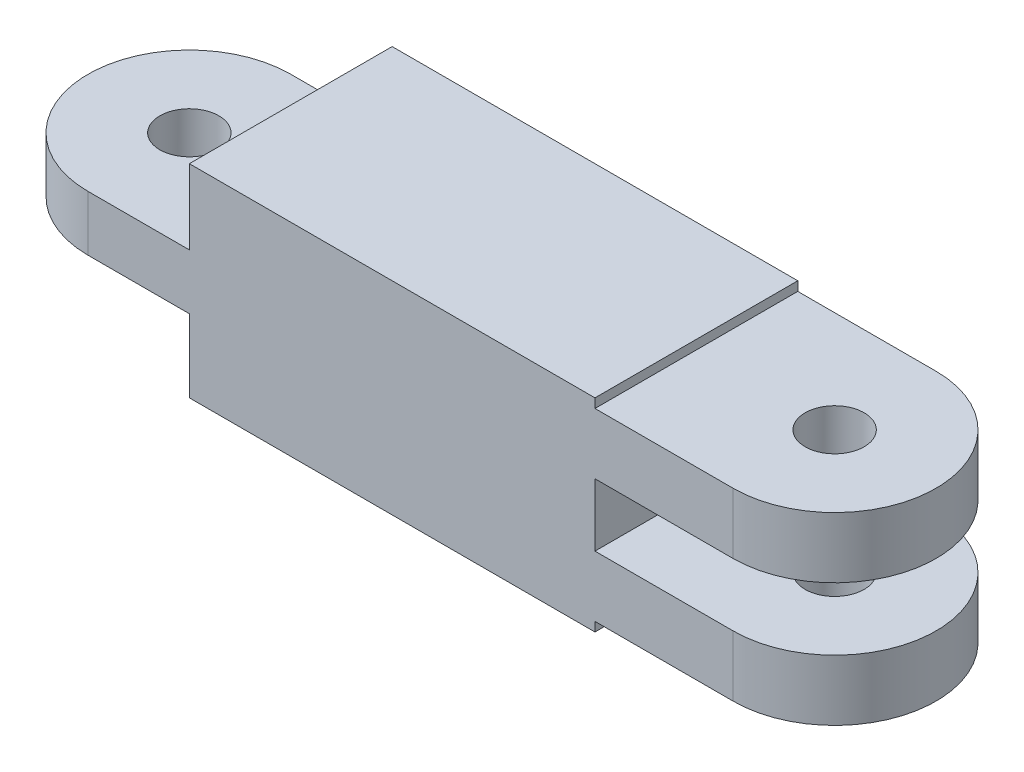
ISO-10303-21;
HEADER;
FILE_DESCRIPTION(('STEP AP214'),'2;1');
FILE_NAME('part.step','',(''),(''),'','','');
FILE_SCHEMA(('AUTOMOTIVE_DESIGN { 1 0 10303 214 1 1 1 1 }'));
ENDSEC;
DATA;
#1=APPLICATION_CONTEXT('core data for automotive mechanical design processes');
#2=APPLICATION_PROTOCOL_DEFINITION('international standard','automotive_design',2000,#1);
#3=PRODUCT_CONTEXT('',#1,'mechanical');
#4=PRODUCT('Part','Part','',(#3));
#5=PRODUCT_RELATED_PRODUCT_CATEGORY('part','',(#4));
#6=PRODUCT_DEFINITION_FORMATION('','',#4);
#7=PRODUCT_DEFINITION_CONTEXT('part definition',#1,'design');
#8=PRODUCT_DEFINITION('design','',#6,#7);
#9=PRODUCT_DEFINITION_SHAPE('','',#8);
#10=(LENGTH_UNIT() NAMED_UNIT(*) SI_UNIT(.MILLI.,.METRE.));
#11=(NAMED_UNIT(*) PLANE_ANGLE_UNIT() SI_UNIT($,.RADIAN.));
#12=(NAMED_UNIT(*) SI_UNIT($,.STERADIAN.) SOLID_ANGLE_UNIT());
#13=UNCERTAINTY_MEASURE_WITH_UNIT(LENGTH_MEASURE(1.E-05),#10,'distance_accuracy_value','');
#14=(GEOMETRIC_REPRESENTATION_CONTEXT(3) GLOBAL_UNCERTAINTY_ASSIGNED_CONTEXT((#13)) GLOBAL_UNIT_ASSIGNED_CONTEXT((#10,
#11,#12)) REPRESENTATION_CONTEXT('',''));
#15=CARTESIAN_POINT('',(0.,0.,0.));
#16=DIRECTION('',(0.,0.,1.));
#17=DIRECTION('',(1.,0.,0.));
#18=AXIS2_PLACEMENT_3D('',#15,#16,#17);
#19=CARTESIAN_POINT('',(17.5030002593994,-42.1589996337891,5.5));
#20=DIRECTION('',(0.,1.,0.));
#21=DIRECTION('',(0.,0.,1.));
#22=AXIS2_PLACEMENT_3D('',#19,#20,#21);
#23=CYLINDRICAL_SURFACE('',#22,5.5);
#24=DIRECTION('',(0.,-1.,0.));
#25=VECTOR('',#24,1.);
#26=CARTESIAN_POINT('',(17.5030002593994,-42.1589996337891,0.));
#27=LINE('',#26,#25);
#28=CARTESIAN_POINT('',(17.5030002593994,-42.1589996337891,0.));
#29=VERTEX_POINT('',#28);
#30=CARTESIAN_POINT('',(17.5030002593994,-45.458999633789,0.));
#31=VERTEX_POINT('',#30);
#32=EDGE_CURVE('E302',#29,#31,#27,.T.);
#33=ORIENTED_EDGE('',*,*,#32,.F.);
#34=CARTESIAN_POINT('',(17.5030002593994,-42.1589996337891,5.5));
#35=DIRECTION('',(0.,1.,0.));
#36=DIRECTION('',(0.,0.,1.));
#37=AXIS2_PLACEMENT_3D('',#34,#35,#36);
#38=CIRCLE('',#37,5.5);
#39=CARTESIAN_POINT('',(17.5030002593994,-42.1589996337891,11.));
#40=VERTEX_POINT('',#39);
#41=EDGE_CURVE('E51',#40,#29,#38,.T.);
#42=ORIENTED_EDGE('',*,*,#41,.F.);
#43=DIRECTION('',(0.,1.,0.));
#44=VECTOR('',#43,1.);
#45=CARTESIAN_POINT('',(17.5030002593994,0.,11.));
#46=LINE('',#45,#44);
#47=CARTESIAN_POINT('',(17.5030002593994,-45.458999633789,11.));
#48=VERTEX_POINT('',#47);
#49=EDGE_CURVE('E305',#48,#40,#46,.T.);
#50=ORIENTED_EDGE('',*,*,#49,.F.);
#51=CARTESIAN_POINT('',(17.5030002593994,-45.458999633789,5.5));
#52=DIRECTION('',(0.,-1.,0.));
#53=DIRECTION('',(0.,0.,-1.));
#54=AXIS2_PLACEMENT_3D('',#51,#52,#53);
#55=CIRCLE('',#54,5.5);
#56=EDGE_CURVE('E11',#31,#48,#55,.T.);
#57=ORIENTED_EDGE('',*,*,#56,.F.);
#58=EDGE_LOOP('',(#33,#42,#50,#57));
#59=FACE_BOUND('',#58,.T.);
#60=ADVANCED_FACE('F41',(#59),#23,.T.);
#61=CARTESIAN_POINT('',(17.5030002593994,-35.4589996337891,5.5));
#62=DIRECTION('',(0.,1.,0.));
#63=DIRECTION('',(0.,0.,1.));
#64=AXIS2_PLACEMENT_3D('',#61,#62,#63);
#65=CYLINDRICAL_SURFACE('',#64,5.5);
#66=DIRECTION('',(0.,-1.,0.));
#67=VECTOR('',#66,1.);
#68=CARTESIAN_POINT('',(17.5030002593994,-35.4589996337891,0.));
#69=LINE('',#68,#67);
#70=CARTESIAN_POINT('',(17.5030002593994,-35.4589996337891,0.));
#71=VERTEX_POINT('',#70);
#72=CARTESIAN_POINT('',(17.5030002593994,-38.7589996337891,0.));
#73=VERTEX_POINT('',#72);
#74=EDGE_CURVE('E289',#71,#73,#69,.T.);
#75=ORIENTED_EDGE('',*,*,#74,.F.);
#76=CARTESIAN_POINT('',(17.5030002593994,-35.4589996337891,5.5));
#77=DIRECTION('',(0.,1.,0.));
#78=DIRECTION('',(0.,0.,1.));
#79=AXIS2_PLACEMENT_3D('',#76,#77,#78);
#80=CIRCLE('',#79,5.5);
#81=CARTESIAN_POINT('',(17.5030002593994,-35.4589996337891,11.));
#82=VERTEX_POINT('',#81);
#83=EDGE_CURVE('E296',#82,#71,#80,.T.);
#84=ORIENTED_EDGE('',*,*,#83,.F.);
#85=DIRECTION('',(0.,1.,0.));
#86=VECTOR('',#85,1.);
#87=CARTESIAN_POINT('',(17.5030002593994,0.,11.));
#88=LINE('',#87,#86);
#89=CARTESIAN_POINT('',(17.5030002593994,-38.7589996337891,11.));
#90=VERTEX_POINT('',#89);
#91=EDGE_CURVE('E292',#90,#82,#88,.T.);
#92=ORIENTED_EDGE('',*,*,#91,.F.);
#93=CARTESIAN_POINT('',(17.5030002593994,-38.7589996337891,5.5));
#94=DIRECTION('',(0.,-1.,0.));
#95=DIRECTION('',(0.,0.,-1.));
#96=AXIS2_PLACEMENT_3D('',#93,#94,#95);
#97=CIRCLE('',#96,5.5);
#98=EDGE_CURVE('E299',#73,#90,#97,.T.);
#99=ORIENTED_EDGE('',*,*,#98,.F.);
#100=EDGE_LOOP('',(#75,#84,#92,#99));
#101=FACE_BOUND('',#100,.T.);
#102=ADVANCED_FACE('F363',(#101),#65,.T.);
#103=CARTESIAN_POINT('',(-17.4969997406006,-39.0089996337891,5.5));
#104=DIRECTION('',(0.,-1.,0.));
#105=DIRECTION('',(0.,0.,-1.));
#106=AXIS2_PLACEMENT_3D('',#103,#104,#105);
#107=CYLINDRICAL_SURFACE('',#106,5.5);
#108=DIRECTION('',(0.,-1.,0.));
#109=VECTOR('',#108,1.);
#110=CARTESIAN_POINT('',(-17.4969997406006,0.,11.));
#111=LINE('',#110,#109);
#112=CARTESIAN_POINT('',(-17.4969997406006,-39.0089996337891,11.));
#113=VERTEX_POINT('',#112);
#114=CARTESIAN_POINT('',(-17.4969997406006,-42.0089996337891,11.));
#115=VERTEX_POINT('',#114);
#116=EDGE_CURVE('E275',#113,#115,#111,.T.);
#117=ORIENTED_EDGE('',*,*,#116,.F.);
#118=CARTESIAN_POINT('',(-17.4969997406006,-39.0089996337891,5.5));
#119=DIRECTION('',(0.,1.,0.));
#120=DIRECTION('',(0.,0.,1.));
#121=AXIS2_PLACEMENT_3D('',#118,#119,#120);
#122=CIRCLE('',#121,5.5);
#123=CARTESIAN_POINT('',(-17.4969997406006,-39.0089996337891,0.));
#124=VERTEX_POINT('',#123);
#125=EDGE_CURVE('E283',#124,#113,#122,.T.);
#126=ORIENTED_EDGE('',*,*,#125,.F.);
#127=DIRECTION('',(0.,1.,0.));
#128=VECTOR('',#127,1.);
#129=CARTESIAN_POINT('',(-17.4969997406006,-39.0089996337891,0.));
#130=LINE('',#129,#128);
#131=CARTESIAN_POINT('',(-17.4969997406006,-42.0089996337891,0.));
#132=VERTEX_POINT('',#131);
#133=EDGE_CURVE('E279',#132,#124,#130,.T.);
#134=ORIENTED_EDGE('',*,*,#133,.F.);
#135=CARTESIAN_POINT('',(-17.4969997406006,-42.0089996337891,5.5));
#136=DIRECTION('',(0.,-1.,0.));
#137=DIRECTION('',(0.,0.,-1.));
#138=AXIS2_PLACEMENT_3D('',#135,#136,#137);
#139=CIRCLE('',#138,5.5);
#140=EDGE_CURVE('E286',#115,#132,#139,.T.);
#141=ORIENTED_EDGE('',*,*,#140,.F.);
#142=EDGE_LOOP('',(#117,#126,#134,#141));
#143=FACE_BOUND('',#142,.T.);
#144=ADVANCED_FACE('F409',(#143),#107,.T.);
#145=CARTESIAN_POINT('',(10.0030002593994,-34.9589996337891,11.));
#146=DIRECTION('',(-1.,0.,0.));
#147=DIRECTION('',(0.,-1.,0.));
#148=AXIS2_PLACEMENT_3D('',#145,#146,#147);
#149=PLANE('',#148);
#150=DIRECTION('',(0.,1.,0.));
#151=VECTOR('',#150,1.);
#152=CARTESIAN_POINT('',(10.0030002593994,-34.9589996337891,11.));
#153=LINE('',#152,#151);
#154=CARTESIAN_POINT('',(10.0030002593994,-42.1589996337891,11.));
#155=VERTEX_POINT('',#154);
#156=CARTESIAN_POINT('',(10.0030002593994,-38.7589996337891,11.));
#157=VERTEX_POINT('',#156);
#158=EDGE_CURVE('E181',#155,#157,#153,.T.);
#159=ORIENTED_EDGE('',*,*,#158,.F.);
#160=DIRECTION('',(0.,0.,1.));
#161=VECTOR('',#160,1.);
#162=CARTESIAN_POINT('',(10.0030002593994,-42.1589996337891,0.));
#163=LINE('',#162,#161);
#164=CARTESIAN_POINT('',(10.0030002593994,-42.1589996337891,0.));
#165=VERTEX_POINT('',#164);
#166=EDGE_CURVE('E159',#165,#155,#163,.T.);
#167=ORIENTED_EDGE('',*,*,#166,.F.);
#168=DIRECTION('',(0.,1.,0.));
#169=VECTOR('',#168,1.);
#170=CARTESIAN_POINT('',(10.0030002593994,-34.9589996337891,0.));
#171=LINE('',#170,#169);
#172=CARTESIAN_POINT('',(10.0030002593994,-38.7589996337891,0.));
#173=VERTEX_POINT('',#172);
#174=EDGE_CURVE('E167',#165,#173,#171,.T.);
#175=ORIENTED_EDGE('',*,*,#174,.T.);
#176=DIRECTION('',(0.,0.,1.));
#177=VECTOR('',#176,1.);
#178=CARTESIAN_POINT('',(10.0030002593994,-38.7589996337891,0.));
#179=LINE('',#178,#177);
#180=EDGE_CURVE('E225',#173,#157,#179,.T.);
#181=ORIENTED_EDGE('',*,*,#180,.T.);
#182=EDGE_LOOP('',(#159,#167,#175,#181));
#183=FACE_BOUND('',#182,.T.);
#184=ADVANCED_FACE('F180',(#183),#149,.F.);
#185=CARTESIAN_POINT('',(-11.9969997406006,-34.9589996337891,11.));
#186=DIRECTION('',(1.,0.,0.));
#187=DIRECTION('',(0.,1.,0.));
#188=AXIS2_PLACEMENT_3D('',#185,#186,#187);
#189=PLANE('',#188);
#190=DIRECTION('',(0.,0.,1.));
#191=VECTOR('',#190,1.);
#192=CARTESIAN_POINT('',(-11.9969997406006,-42.0089996337891,0.));
#193=LINE('',#192,#191);
#194=CARTESIAN_POINT('',(-11.9969997406006,-42.0089996337891,0.));
#195=VERTEX_POINT('',#194);
#196=CARTESIAN_POINT('',(-11.9969997406006,-42.0089996337891,11.));
#197=VERTEX_POINT('',#196);
#198=EDGE_CURVE('E205',#195,#197,#193,.T.);
#199=ORIENTED_EDGE('',*,*,#198,.F.);
#200=DIRECTION('',(0.,-1.,0.));
#201=VECTOR('',#200,1.);
#202=CARTESIAN_POINT('',(-11.9969997406006,-34.9589996337891,0.));
#203=LINE('',#202,#201);
#204=CARTESIAN_POINT('',(-11.9969997406006,-45.9589996337891,0.));
#205=VERTEX_POINT('',#204);
#206=EDGE_CURVE('E228',#195,#205,#203,.T.);
#207=ORIENTED_EDGE('',*,*,#206,.T.);
#208=DIRECTION('',(0.,0.,-1.));
#209=VECTOR('',#208,1.);
#210=CARTESIAN_POINT('',(-11.9969997406006,-45.9589996337891,11.));
#211=LINE('',#210,#209);
#212=CARTESIAN_POINT('',(-11.9969997406006,-45.9589996337891,11.));
#213=VERTEX_POINT('',#212);
#214=EDGE_CURVE('E271',#213,#205,#211,.T.);
#215=ORIENTED_EDGE('',*,*,#214,.F.);
#216=DIRECTION('',(0.,-1.,0.));
#217=VECTOR('',#216,1.);
#218=CARTESIAN_POINT('',(-11.9969997406006,-34.9589996337891,11.));
#219=LINE('',#218,#217);
#220=EDGE_CURVE('E237',#197,#213,#219,.T.);
#221=ORIENTED_EDGE('',*,*,#220,.F.);
#222=EDGE_LOOP('',(#199,#207,#215,#221));
#223=FACE_BOUND('',#222,.T.);
#224=ADVANCED_FACE('F319',(#223),#189,.F.);
#225=DIRECTION('',(0.,0.,1.));
#226=VECTOR('',#225,1.);
#227=CARTESIAN_POINT('',(10.0030002593994,-35.4589996337891,0.));
#228=LINE('',#227,#226);
#229=CARTESIAN_POINT('',(10.0030002593994,-35.4589996337891,0.));
#230=VERTEX_POINT('',#229);
#231=CARTESIAN_POINT('',(10.0030002593994,-35.4589996337891,11.));
#232=VERTEX_POINT('',#231);
#233=EDGE_CURVE('E219',#230,#232,#228,.T.);
#234=ORIENTED_EDGE('',*,*,#233,.F.);
#235=CARTESIAN_POINT('',(10.0030002593994,-34.9589996337891,0.));
#236=VERTEX_POINT('',#235);
#237=EDGE_CURVE('E177',#230,#236,#171,.T.);
#238=ORIENTED_EDGE('',*,*,#237,.T.);
#239=DIRECTION('',(0.,0.,-1.));
#240=VECTOR('',#239,1.);
#241=CARTESIAN_POINT('',(10.0030002593994,-34.9589996337891,11.));
#242=LINE('',#241,#240);
#243=CARTESIAN_POINT('',(10.0030002593994,-34.9589996337891,11.));
#244=VERTEX_POINT('',#243);
#245=EDGE_CURVE('E263',#244,#236,#242,.T.);
#246=ORIENTED_EDGE('',*,*,#245,.F.);
#247=EDGE_CURVE('E240',#232,#244,#153,.T.);
#248=ORIENTED_EDGE('',*,*,#247,.F.);
#249=EDGE_LOOP('',(#234,#238,#246,#248));
#250=FACE_BOUND('',#249,.T.);
#251=ADVANCED_FACE('F356',(#250),#149,.F.);
#252=CARTESIAN_POINT('',(-11.9969997406006,-34.9589996337891,0.));
#253=VERTEX_POINT('',#252);
#254=CARTESIAN_POINT('',(-11.9969997406006,-39.0089996337891,0.));
#255=VERTEX_POINT('',#254);
#256=EDGE_CURVE('E249',#253,#255,#203,.T.);
#257=ORIENTED_EDGE('',*,*,#256,.T.);
#258=DIRECTION('',(0.,0.,1.));
#259=VECTOR('',#258,1.);
#260=CARTESIAN_POINT('',(-11.9969997406006,-39.0089996337891,0.));
#261=LINE('',#260,#259);
#262=CARTESIAN_POINT('',(-11.9969997406006,-39.0089996337891,11.));
#263=VERTEX_POINT('',#262);
#264=EDGE_CURVE('E201',#255,#263,#261,.T.);
#265=ORIENTED_EDGE('',*,*,#264,.T.);
#266=CARTESIAN_POINT('',(-11.9969997406006,-34.9589996337891,11.));
#267=VERTEX_POINT('',#266);
#268=EDGE_CURVE('E232',#267,#263,#219,.T.);
#269=ORIENTED_EDGE('',*,*,#268,.F.);
#270=DIRECTION('',(0.,0.,-1.));
#271=VECTOR('',#270,1.);
#272=CARTESIAN_POINT('',(-11.9969997406006,-34.9589996337891,11.));
#273=LINE('',#272,#271);
#274=EDGE_CURVE('E248',#267,#253,#273,.T.);
#275=ORIENTED_EDGE('',*,*,#274,.T.);
#276=EDGE_LOOP('',(#257,#265,#269,#275));
#277=FACE_BOUND('',#276,.T.);
#278=ADVANCED_FACE('F344',(#277),#189,.F.);
#279=CARTESIAN_POINT('',(-11.9969997406006,-45.9589996337891,11.));
#280=DIRECTION('',(0.,1.,0.));
#281=DIRECTION('',(0.,0.,1.));
#282=AXIS2_PLACEMENT_3D('',#279,#280,#281);
#283=PLANE('',#282);
#284=DIRECTION('',(1.,0.,0.));
#285=VECTOR('',#284,1.);
#286=CARTESIAN_POINT('',(-11.9969997406006,-45.9589996337891,0.));
#287=LINE('',#286,#285);
#288=CARTESIAN_POINT('',(10.0030002593994,-45.9589996337891,0.));
#289=VERTEX_POINT('',#288);
#290=EDGE_CURVE('E253',#205,#289,#287,.T.);
#291=ORIENTED_EDGE('',*,*,#290,.T.);
#292=DIRECTION('',(0.,0.,-1.));
#293=VECTOR('',#292,1.);
#294=CARTESIAN_POINT('',(10.0030002593994,-45.9589996337891,11.));
#295=LINE('',#294,#293);
#296=CARTESIAN_POINT('',(10.0030002593994,-45.9589996337891,11.));
#297=VERTEX_POINT('',#296);
#298=EDGE_CURVE('E267',#297,#289,#295,.T.);
#299=ORIENTED_EDGE('',*,*,#298,.F.);
#300=DIRECTION('',(1.,0.,0.));
#301=VECTOR('',#300,1.);
#302=CARTESIAN_POINT('',(-11.9969997406006,-45.9589996337891,11.));
#303=LINE('',#302,#301);
#304=EDGE_CURVE('E236',#213,#297,#303,.T.);
#305=ORIENTED_EDGE('',*,*,#304,.F.);
#306=ORIENTED_EDGE('',*,*,#214,.T.);
#307=EDGE_LOOP('',(#291,#299,#305,#306));
#308=FACE_BOUND('',#307,.T.);
#309=ADVANCED_FACE('F327',(#308),#283,.F.);
#310=CARTESIAN_POINT('',(10.0030002593994,-45.458999633789,0.));
#311=VERTEX_POINT('',#310);
#312=EDGE_CURVE('E176',#289,#311,#171,.T.);
#313=ORIENTED_EDGE('',*,*,#312,.T.);
#314=DIRECTION('',(0.,0.,1.));
#315=VECTOR('',#314,1.);
#316=CARTESIAN_POINT('',(10.0030002593994,-45.458999633789,0.));
#317=LINE('',#316,#315);
#318=CARTESIAN_POINT('',(10.0030002593994,-45.458999633789,11.));
#319=VERTEX_POINT('',#318);
#320=EDGE_CURVE('E163',#311,#319,#317,.T.);
#321=ORIENTED_EDGE('',*,*,#320,.T.);
#322=EDGE_CURVE('E241',#297,#319,#153,.T.);
#323=ORIENTED_EDGE('',*,*,#322,.F.);
#324=ORIENTED_EDGE('',*,*,#298,.T.);
#325=EDGE_LOOP('',(#313,#321,#323,#324));
#326=FACE_BOUND('',#325,.T.);
#327=ADVANCED_FACE('F425',(#326),#149,.F.);
#328=CARTESIAN_POINT('',(-11.9969997406006,-34.9589996337891,11.));
#329=DIRECTION('',(0.,-1.,0.));
#330=DIRECTION('',(0.,0.,-1.));
#331=AXIS2_PLACEMENT_3D('',#328,#329,#330);
#332=PLANE('',#331);
#333=DIRECTION('',(-1.,0.,0.));
#334=VECTOR('',#333,1.);
#335=CARTESIAN_POINT('',(-11.9969997406006,-34.9589996337891,0.));
#336=LINE('',#335,#334);
#337=EDGE_CURVE('E257',#236,#253,#336,.T.);
#338=ORIENTED_EDGE('',*,*,#337,.T.);
#339=ORIENTED_EDGE('',*,*,#274,.F.);
#340=DIRECTION('',(-1.,0.,0.));
#341=VECTOR('',#340,1.);
#342=CARTESIAN_POINT('',(-11.9969997406006,-34.9589996337891,11.));
#343=LINE('',#342,#341);
#344=EDGE_CURVE('E245',#244,#267,#343,.T.);
#345=ORIENTED_EDGE('',*,*,#344,.F.);
#346=ORIENTED_EDGE('',*,*,#245,.T.);
#347=EDGE_LOOP('',(#338,#339,#345,#346));
#348=FACE_BOUND('',#347,.T.);
#349=ADVANCED_FACE('F350',(#348),#332,.F.);
#350=CARTESIAN_POINT('',(0.,0.,11.));
#351=DIRECTION('',(0.,0.,1.));
#352=DIRECTION('',(1.,0.,0.));
#353=AXIS2_PLACEMENT_3D('',#350,#351,#352);
#354=PLANE('',#353);
#355=DIRECTION('',(1.,0.,0.));
#356=VECTOR('',#355,1.);
#357=CARTESIAN_POINT('',(10.0030002593994,-45.458999633789,11.));
#358=LINE('',#357,#356);
#359=EDGE_CURVE('E368',#319,#48,#358,.T.);
#360=ORIENTED_EDGE('',*,*,#359,.T.);
#361=ORIENTED_EDGE('',*,*,#49,.T.);
#362=DIRECTION('',(-1.,0.,0.));
#363=VECTOR('',#362,1.);
#364=CARTESIAN_POINT('',(10.0030002593994,-42.1589996337891,11.));
#365=LINE('',#364,#363);
#366=EDGE_CURVE('E192',#40,#155,#365,.T.);
#367=ORIENTED_EDGE('',*,*,#366,.T.);
#368=ORIENTED_EDGE('',*,*,#158,.T.);
#369=DIRECTION('',(1.,0.,0.));
#370=VECTOR('',#369,1.);
#371=CARTESIAN_POINT('',(10.0030002593994,-38.7589996337891,11.));
#372=LINE('',#371,#370);
#373=EDGE_CURVE('E216',#157,#90,#372,.T.);
#374=ORIENTED_EDGE('',*,*,#373,.T.);
#375=ORIENTED_EDGE('',*,*,#91,.T.);
#376=DIRECTION('',(-1.,0.,0.));
#377=VECTOR('',#376,1.);
#378=CARTESIAN_POINT('',(10.0030002593994,-35.4589996337891,11.));
#379=LINE('',#378,#377);
#380=EDGE_CURVE('E209',#82,#232,#379,.T.);
#381=ORIENTED_EDGE('',*,*,#380,.T.);
#382=ORIENTED_EDGE('',*,*,#247,.T.);
#383=ORIENTED_EDGE('',*,*,#344,.T.);
#384=ORIENTED_EDGE('',*,*,#268,.T.);
#385=DIRECTION('',(-1.,0.,0.));
#386=VECTOR('',#385,1.);
#387=CARTESIAN_POINT('',(-11.9969997406006,-39.0089996337891,11.));
#388=LINE('',#387,#386);
#389=EDGE_CURVE('E183',#263,#113,#388,.T.);
#390=ORIENTED_EDGE('',*,*,#389,.T.);
#391=ORIENTED_EDGE('',*,*,#116,.T.);
#392=DIRECTION('',(1.,0.,0.));
#393=VECTOR('',#392,1.);
#394=CARTESIAN_POINT('',(-11.9969997406006,-42.0089996337891,11.));
#395=LINE('',#394,#393);
#396=EDGE_CURVE('E188',#115,#197,#395,.T.);
#397=ORIENTED_EDGE('',*,*,#396,.T.);
#398=ORIENTED_EDGE('',*,*,#220,.T.);
#399=ORIENTED_EDGE('',*,*,#304,.T.);
#400=ORIENTED_EDGE('',*,*,#322,.T.);
#401=EDGE_LOOP('',(#360,#361,#367,#368,#374,#375,#381,#382,#383,#384,#390,#391,#397,#398,#399,#400));
#402=FACE_BOUND('',#401,.T.);
#403=ADVANCED_FACE('F331',(#402),#354,.T.);
#404=CARTESIAN_POINT('',(0.,0.,0.));
#405=DIRECTION('',(0.,0.,1.));
#406=DIRECTION('',(1.,0.,0.));
#407=AXIS2_PLACEMENT_3D('',#404,#405,#406);
#408=PLANE('',#407);
#409=DIRECTION('',(-1.,0.,0.));
#410=VECTOR('',#409,1.);
#411=CARTESIAN_POINT('',(10.0030002593994,-42.1589996337891,0.));
#412=LINE('',#411,#410);
#413=EDGE_CURVE('E154',#29,#165,#412,.T.);
#414=ORIENTED_EDGE('',*,*,#413,.F.);
#415=ORIENTED_EDGE('',*,*,#32,.T.);
#416=DIRECTION('',(1.,0.,0.));
#417=VECTOR('',#416,1.);
#418=CARTESIAN_POINT('',(10.0030002593994,-45.458999633789,0.));
#419=LINE('',#418,#417);
#420=EDGE_CURVE('E164',#311,#31,#419,.T.);
#421=ORIENTED_EDGE('',*,*,#420,.F.);
#422=ORIENTED_EDGE('',*,*,#312,.F.);
#423=ORIENTED_EDGE('',*,*,#290,.F.);
#424=ORIENTED_EDGE('',*,*,#206,.F.);
#425=DIRECTION('',(1.,0.,0.));
#426=VECTOR('',#425,1.);
#427=CARTESIAN_POINT('',(-11.9969997406006,-42.0089996337891,0.));
#428=LINE('',#427,#426);
#429=EDGE_CURVE('E199',#132,#195,#428,.T.);
#430=ORIENTED_EDGE('',*,*,#429,.F.);
#431=ORIENTED_EDGE('',*,*,#133,.T.);
#432=DIRECTION('',(-1.,0.,0.));
#433=VECTOR('',#432,1.);
#434=CARTESIAN_POINT('',(-11.9969997406006,-39.0089996337891,0.));
#435=LINE('',#434,#433);
#436=EDGE_CURVE('E195',#255,#124,#435,.T.);
#437=ORIENTED_EDGE('',*,*,#436,.F.);
#438=ORIENTED_EDGE('',*,*,#256,.F.);
#439=ORIENTED_EDGE('',*,*,#337,.F.);
#440=ORIENTED_EDGE('',*,*,#237,.F.);
#441=DIRECTION('',(-1.,0.,0.));
#442=VECTOR('',#441,1.);
#443=CARTESIAN_POINT('',(10.0030002593994,-35.4589996337891,0.));
#444=LINE('',#443,#442);
#445=EDGE_CURVE('E213',#71,#230,#444,.T.);
#446=ORIENTED_EDGE('',*,*,#445,.F.);
#447=ORIENTED_EDGE('',*,*,#74,.T.);
#448=DIRECTION('',(1.,0.,0.));
#449=VECTOR('',#448,1.);
#450=CARTESIAN_POINT('',(10.0030002593994,-38.7589996337891,0.));
#451=LINE('',#450,#449);
#452=EDGE_CURVE('E171',#173,#73,#451,.T.);
#453=ORIENTED_EDGE('',*,*,#452,.F.);
#454=ORIENTED_EDGE('',*,*,#174,.F.);
#455=EDGE_LOOP('',(#414,#415,#421,#422,#423,#424,#430,#431,#437,#438,#439,#440,#446,#447,#453,#454));
#456=FACE_BOUND('',#455,.T.);
#457=ADVANCED_FACE('F168',(#456),#408,.F.);
#458=CARTESIAN_POINT('',(10.0030002593994,-35.4589996337891,0.));
#459=DIRECTION('',(0.,1.,0.));
#460=DIRECTION('',(0.,0.,1.));
#461=AXIS2_PLACEMENT_3D('',#458,#459,#460);
#462=PLANE('',#461);
#463=CARTESIAN_POINT('',(17.5030002593994,-35.4589996337891,5.5));
#464=DIRECTION('',(0.,1.,0.));
#465=DIRECTION('',(0.,0.,1.));
#466=AXIS2_PLACEMENT_3D('',#463,#464,#465);
#467=CIRCLE('',#466,1.6);
#468=CARTESIAN_POINT('',(17.5030002593994,-35.4589996337891,7.1));
#469=VERTEX_POINT('',#468);
#470=EDGE_CURVE('E389',#469,#469,#467,.T.);
#471=ORIENTED_EDGE('',*,*,#470,.F.);
#472=EDGE_LOOP('',(#471));
#473=FACE_BOUND('',#472,.T.);
#474=ORIENTED_EDGE('',*,*,#380,.F.);
#475=ORIENTED_EDGE('',*,*,#83,.T.);
#476=ORIENTED_EDGE('',*,*,#445,.T.);
#477=ORIENTED_EDGE('',*,*,#233,.T.);
#478=EDGE_LOOP('',(#474,#475,#476,#477));
#479=FACE_BOUND('',#478,.T.);
#480=ADVANCED_FACE('F359',(#473,#479),#462,.T.);
#481=CARTESIAN_POINT('',(10.0030002593994,-38.7589996337891,0.));
#482=DIRECTION('',(0.,-1.,0.));
#483=DIRECTION('',(0.,0.,-1.));
#484=AXIS2_PLACEMENT_3D('',#481,#482,#483);
#485=PLANE('',#484);
#486=CARTESIAN_POINT('',(17.5030002593994,-38.7589996337891,5.5));
#487=DIRECTION('',(0.,-1.,0.));
#488=DIRECTION('',(0.,0.,-1.));
#489=AXIS2_PLACEMENT_3D('',#486,#487,#488);
#490=CIRCLE('',#489,1.6);
#491=CARTESIAN_POINT('',(17.5030002593994,-38.7589996337891,3.9));
#492=VERTEX_POINT('',#491);
#493=EDGE_CURVE('E381',#492,#492,#490,.T.);
#494=ORIENTED_EDGE('',*,*,#493,.F.);
#495=EDGE_LOOP('',(#494));
#496=FACE_BOUND('',#495,.T.);
#497=ORIENTED_EDGE('',*,*,#452,.T.);
#498=ORIENTED_EDGE('',*,*,#98,.T.);
#499=ORIENTED_EDGE('',*,*,#373,.F.);
#500=ORIENTED_EDGE('',*,*,#180,.F.);
#501=EDGE_LOOP('',(#497,#498,#499,#500));
#502=FACE_BOUND('',#501,.T.);
#503=ADVANCED_FACE('F365',(#496,#502),#485,.T.);
#504=CARTESIAN_POINT('',(-11.9969997406006,-42.0089996337891,0.));
#505=DIRECTION('',(0.,-1.,0.));
#506=DIRECTION('',(0.,0.,-1.));
#507=AXIS2_PLACEMENT_3D('',#504,#505,#506);
#508=PLANE('',#507);
#509=CARTESIAN_POINT('',(-17.4969997406006,-42.0089996337891,5.5));
#510=DIRECTION('',(0.,-1.,0.));
#511=DIRECTION('',(0.,0.,-1.));
#512=AXIS2_PLACEMENT_3D('',#509,#510,#511);
#513=CIRCLE('',#512,1.6);
#514=CARTESIAN_POINT('',(-17.4969997406006,-42.0089996337891,3.9));
#515=VERTEX_POINT('',#514);
#516=EDGE_CURVE('E372',#515,#515,#513,.T.);
#517=ORIENTED_EDGE('',*,*,#516,.F.);
#518=EDGE_LOOP('',(#517));
#519=FACE_BOUND('',#518,.T.);
#520=ORIENTED_EDGE('',*,*,#396,.F.);
#521=ORIENTED_EDGE('',*,*,#140,.T.);
#522=ORIENTED_EDGE('',*,*,#429,.T.);
#523=ORIENTED_EDGE('',*,*,#198,.T.);
#524=EDGE_LOOP('',(#520,#521,#522,#523));
#525=FACE_BOUND('',#524,.T.);
#526=ADVANCED_FACE('F335',(#519,#525),#508,.T.);
#527=CARTESIAN_POINT('',(-11.9969997406006,-39.0089996337891,0.));
#528=DIRECTION('',(0.,1.,0.));
#529=DIRECTION('',(0.,0.,1.));
#530=AXIS2_PLACEMENT_3D('',#527,#528,#529);
#531=PLANE('',#530);
#532=CARTESIAN_POINT('',(-17.4969997406006,-39.0089996337891,5.5));
#533=DIRECTION('',(0.,1.,0.));
#534=DIRECTION('',(0.,0.,1.));
#535=AXIS2_PLACEMENT_3D('',#532,#533,#534);
#536=CIRCLE('',#535,1.6);
#537=CARTESIAN_POINT('',(-17.4969997406006,-39.0089996337891,7.1));
#538=VERTEX_POINT('',#537);
#539=EDGE_CURVE('E375',#538,#538,#536,.T.);
#540=ORIENTED_EDGE('',*,*,#539,.F.);
#541=EDGE_LOOP('',(#540));
#542=FACE_BOUND('',#541,.T.);
#543=ORIENTED_EDGE('',*,*,#436,.T.);
#544=ORIENTED_EDGE('',*,*,#125,.T.);
#545=ORIENTED_EDGE('',*,*,#389,.F.);
#546=ORIENTED_EDGE('',*,*,#264,.F.);
#547=EDGE_LOOP('',(#543,#544,#545,#546));
#548=FACE_BOUND('',#547,.T.);
#549=ADVANCED_FACE('F341',(#542,#548),#531,.T.);
#550=CARTESIAN_POINT('',(10.0030002593994,-42.1589996337891,0.));
#551=DIRECTION('',(0.,1.,0.));
#552=DIRECTION('',(0.,0.,1.));
#553=AXIS2_PLACEMENT_3D('',#550,#551,#552);
#554=PLANE('',#553);
#555=CARTESIAN_POINT('',(17.5030002593994,-42.1589996337891,5.5));
#556=DIRECTION('',(0.,1.,0.));
#557=DIRECTION('',(0.,0.,1.));
#558=AXIS2_PLACEMENT_3D('',#555,#556,#557);
#559=CIRCLE('',#558,1.6);
#560=CARTESIAN_POINT('',(17.5030002593994,-42.1589996337891,7.1));
#561=VERTEX_POINT('',#560);
#562=EDGE_CURVE('E385',#561,#561,#559,.T.);
#563=ORIENTED_EDGE('',*,*,#562,.F.);
#564=EDGE_LOOP('',(#563));
#565=FACE_BOUND('',#564,.T.);
#566=ORIENTED_EDGE('',*,*,#366,.F.);
#567=ORIENTED_EDGE('',*,*,#41,.T.);
#568=ORIENTED_EDGE('',*,*,#413,.T.);
#569=ORIENTED_EDGE('',*,*,#166,.T.);
#570=EDGE_LOOP('',(#566,#567,#568,#569));
#571=FACE_BOUND('',#570,.T.);
#572=ADVANCED_FACE('F157',(#565,#571),#554,.T.);
#573=CARTESIAN_POINT('',(10.0030002593994,-45.458999633789,0.));
#574=DIRECTION('',(0.,-1.,0.));
#575=DIRECTION('',(0.,0.,-1.));
#576=AXIS2_PLACEMENT_3D('',#573,#574,#575);
#577=PLANE('',#576);
#578=CARTESIAN_POINT('',(17.5030002593994,-45.458999633789,5.5));
#579=DIRECTION('',(0.,-1.,0.));
#580=DIRECTION('',(0.,0.,-1.));
#581=AXIS2_PLACEMENT_3D('',#578,#579,#580);
#582=CIRCLE('',#581,1.6);
#583=CARTESIAN_POINT('',(17.5030002593994,-45.458999633789,3.9));
#584=VERTEX_POINT('',#583);
#585=EDGE_CURVE('E45',#584,#584,#582,.T.);
#586=ORIENTED_EDGE('',*,*,#585,.F.);
#587=EDGE_LOOP('',(#586));
#588=FACE_BOUND('',#587,.T.);
#589=ORIENTED_EDGE('',*,*,#420,.T.);
#590=ORIENTED_EDGE('',*,*,#56,.T.);
#591=ORIENTED_EDGE('',*,*,#359,.F.);
#592=ORIENTED_EDGE('',*,*,#320,.F.);
#593=EDGE_LOOP('',(#589,#590,#591,#592));
#594=FACE_BOUND('',#593,.T.);
#595=ADVANCED_FACE('F400',(#588,#594),#577,.T.);
#596=CARTESIAN_POINT('',(-17.4969997406006,-45.9589996337891,5.5));
#597=DIRECTION('',(0.,1.,0.));
#598=DIRECTION('',(0.,0.,1.));
#599=AXIS2_PLACEMENT_3D('',#596,#597,#598);
#600=CYLINDRICAL_SURFACE('',#599,1.6);
#601=ORIENTED_EDGE('',*,*,#516,.T.);
#602=EDGE_LOOP('',(#601));
#603=FACE_BOUND('',#602,.T.);
#604=ORIENTED_EDGE('',*,*,#539,.T.);
#605=EDGE_LOOP('',(#604));
#606=FACE_BOUND('',#605,.T.);
#607=ADVANCED_FACE('F402',(#603,#606),#600,.F.);
#608=CARTESIAN_POINT('',(17.5030002593994,-45.9589996337891,5.5));
#609=DIRECTION('',(0.,1.,0.));
#610=DIRECTION('',(0.,0.,1.));
#611=AXIS2_PLACEMENT_3D('',#608,#609,#610);
#612=CYLINDRICAL_SURFACE('',#611,1.6);
#613=ORIENTED_EDGE('',*,*,#562,.T.);
#614=EDGE_LOOP('',(#613));
#615=FACE_BOUND('',#614,.T.);
#616=ORIENTED_EDGE('',*,*,#585,.T.);
#617=EDGE_LOOP('',(#616));
#618=FACE_BOUND('',#617,.T.);
#619=ADVANCED_FACE('F398',(#615,#618),#612,.F.);
#620=ORIENTED_EDGE('',*,*,#493,.T.);
#621=EDGE_LOOP('',(#620));
#622=FACE_BOUND('',#621,.T.);
#623=ORIENTED_EDGE('',*,*,#470,.T.);
#624=EDGE_LOOP('',(#623));
#625=FACE_BOUND('',#624,.T.);
#626=ADVANCED_FACE('F454',(#622,#625),#612,.F.);
#627=CLOSED_SHELL('',(#60,#102,#144,#184,#224,#251,#278,#309,#327,#349,#403,#457,#480,#503,#526,
#549,#572,#595,#607,#619,#626));
#628=MANIFOLD_SOLID_BREP('B2',#627);
#629=ADVANCED_BREP_SHAPE_REPRESENTATION('',(#18,#628),#14);
#630=SHAPE_DEFINITION_REPRESENTATION(#9,#629);
ENDSEC;
END-ISO-10303-21;
